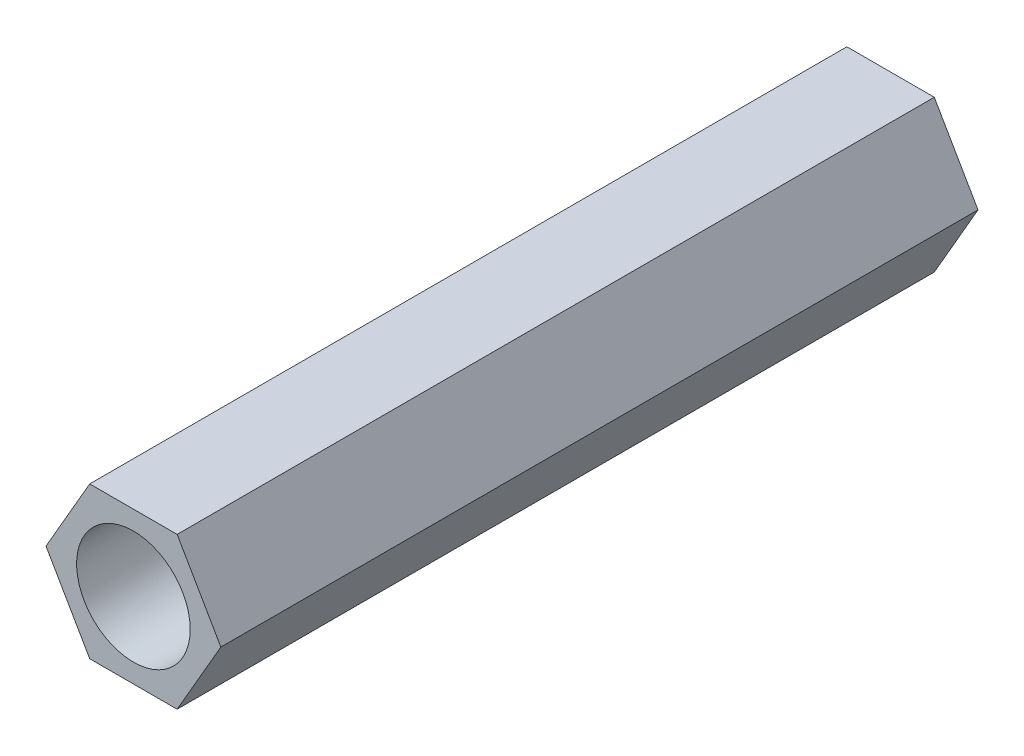
ISO-10303-21;
HEADER;
FILE_DESCRIPTION(('STEP AP214'),'2;1');
FILE_NAME('part.step','',(''),(''),'','','');
FILE_SCHEMA(('AUTOMOTIVE_DESIGN { 1 0 10303 214 1 1 1 1 }'));
ENDSEC;
DATA;
#1=APPLICATION_CONTEXT('core data for automotive mechanical design processes');
#2=APPLICATION_PROTOCOL_DEFINITION('international standard','automotive_design',2000,#1);
#3=PRODUCT_CONTEXT('',#1,'mechanical');
#4=PRODUCT('Part','Part','',(#3));
#5=PRODUCT_RELATED_PRODUCT_CATEGORY('part','',(#4));
#6=PRODUCT_DEFINITION_FORMATION('','',#4);
#7=PRODUCT_DEFINITION_CONTEXT('part definition',#1,'design');
#8=PRODUCT_DEFINITION('design','',#6,#7);
#9=PRODUCT_DEFINITION_SHAPE('','',#8);
#10=(LENGTH_UNIT() NAMED_UNIT(*) SI_UNIT(.MILLI.,.METRE.));
#11=(NAMED_UNIT(*) PLANE_ANGLE_UNIT() SI_UNIT($,.RADIAN.));
#12=(NAMED_UNIT(*) SI_UNIT($,.STERADIAN.) SOLID_ANGLE_UNIT());
#13=UNCERTAINTY_MEASURE_WITH_UNIT(LENGTH_MEASURE(1.E-05),#10,'distance_accuracy_value','');
#14=(GEOMETRIC_REPRESENTATION_CONTEXT(3) GLOBAL_UNCERTAINTY_ASSIGNED_CONTEXT((#13)) GLOBAL_UNIT_ASSIGNED_CONTEXT((#10,
#11,#12)) REPRESENTATION_CONTEXT('',''));
#15=CARTESIAN_POINT('',(0.,0.,0.));
#16=DIRECTION('',(0.,0.,1.));
#17=DIRECTION('',(1.,0.,0.));
#18=AXIS2_PLACEMENT_3D('',#15,#16,#17);
#19=CARTESIAN_POINT('',(0.,0.,20.));
#20=DIRECTION('',(0.,0.,1.));
#21=DIRECTION('',(1.,0.,0.));
#22=AXIS2_PLACEMENT_3D('',#19,#20,#21);
#23=PLANE('',#22);
#24=DIRECTION('',(0.5,0.866025403784439,0.));
#25=VECTOR('',#24,1.);
#26=CARTESIAN_POINT('',(1.15470053837925,-2.,20.));
#27=LINE('',#26,#25);
#28=CARTESIAN_POINT('',(1.15470053837925,-2.,20.));
#29=VERTEX_POINT('',#28);
#30=CARTESIAN_POINT('',(2.3094010767585,0.,20.));
#31=VERTEX_POINT('',#30);
#32=EDGE_CURVE('E156',#29,#31,#27,.T.);
#33=ORIENTED_EDGE('',*,*,#32,.T.);
#34=DIRECTION('',(-0.5,0.866025403784439,0.));
#35=VECTOR('',#34,1.);
#36=CARTESIAN_POINT('',(2.3094010767585,0.,20.));
#37=LINE('',#36,#35);
#38=CARTESIAN_POINT('',(1.15470053837925,2.,20.));
#39=VERTEX_POINT('',#38);
#40=EDGE_CURVE('E104',#31,#39,#37,.T.);
#41=ORIENTED_EDGE('',*,*,#40,.T.);
#42=DIRECTION('',(-1.,0.,0.));
#43=VECTOR('',#42,1.);
#44=CARTESIAN_POINT('',(1.15470053837925,2.,20.));
#45=LINE('',#44,#43);
#46=CARTESIAN_POINT('',(-1.15470053837925,2.,20.));
#47=VERTEX_POINT('',#46);
#48=EDGE_CURVE('E117',#39,#47,#45,.T.);
#49=ORIENTED_EDGE('',*,*,#48,.T.);
#50=DIRECTION('',(-0.5,-0.866025403784439,0.));
#51=VECTOR('',#50,1.);
#52=CARTESIAN_POINT('',(-1.15470053837925,2.,20.));
#53=LINE('',#52,#51);
#54=CARTESIAN_POINT('',(-2.3094010767585,0.,20.));
#55=VERTEX_POINT('',#54);
#56=EDGE_CURVE('E111',#47,#55,#53,.T.);
#57=ORIENTED_EDGE('',*,*,#56,.T.);
#58=DIRECTION('',(0.5,-0.866025403784438,0.));
#59=VECTOR('',#58,1.);
#60=CARTESIAN_POINT('',(-2.3094010767585,0.,20.));
#61=LINE('',#60,#59);
#62=CARTESIAN_POINT('',(-1.15470053837925,-2.,20.));
#63=VERTEX_POINT('',#62);
#64=EDGE_CURVE('E115',#55,#63,#61,.T.);
#65=ORIENTED_EDGE('',*,*,#64,.T.);
#66=DIRECTION('',(1.,0.,0.));
#67=VECTOR('',#66,1.);
#68=CARTESIAN_POINT('',(-1.15470053837925,-2.,20.));
#69=LINE('',#68,#67);
#70=EDGE_CURVE('E67',#63,#29,#69,.T.);
#71=ORIENTED_EDGE('',*,*,#70,.T.);
#72=EDGE_LOOP('',(#33,#41,#49,#57,#65,#71));
#73=FACE_BOUND('',#72,.T.);
#74=CARTESIAN_POINT('',(0.,0.,20.));
#75=DIRECTION('',(0.,0.,1.));
#76=DIRECTION('',(1.,0.,0.));
#77=AXIS2_PLACEMENT_3D('',#74,#75,#76);
#78=CIRCLE('',#77,1.5);
#79=CARTESIAN_POINT('',(1.5,0.,20.));
#80=VERTEX_POINT('',#79);
#81=EDGE_CURVE('E144',#80,#80,#78,.T.);
#82=ORIENTED_EDGE('',*,*,#81,.F.);
#83=EDGE_LOOP('',(#82));
#84=FACE_BOUND('',#83,.T.);
#85=ADVANCED_FACE('F49',(#73,#84),#23,.T.);
#86=CARTESIAN_POINT('',(0.,0.,0.));
#87=DIRECTION('',(0.,0.,1.));
#88=DIRECTION('',(1.,0.,0.));
#89=AXIS2_PLACEMENT_3D('',#86,#87,#88);
#90=PLANE('',#89);
#91=DIRECTION('',(0.5,0.866025403784439,0.));
#92=VECTOR('',#91,1.);
#93=CARTESIAN_POINT('',(1.15470053837925,-2.,0.));
#94=LINE('',#93,#92);
#95=CARTESIAN_POINT('',(1.15470053837925,-2.,0.));
#96=VERTEX_POINT('',#95);
#97=CARTESIAN_POINT('',(2.3094010767585,0.,0.));
#98=VERTEX_POINT('',#97);
#99=EDGE_CURVE('E139',#96,#98,#94,.T.);
#100=ORIENTED_EDGE('',*,*,#99,.F.);
#101=DIRECTION('',(1.,0.,0.));
#102=VECTOR('',#101,1.);
#103=CARTESIAN_POINT('',(-1.15470053837925,-2.,0.));
#104=LINE('',#103,#102);
#105=CARTESIAN_POINT('',(-1.15470053837925,-2.,0.));
#106=VERTEX_POINT('',#105);
#107=EDGE_CURVE('E96',#106,#96,#104,.T.);
#108=ORIENTED_EDGE('',*,*,#107,.F.);
#109=DIRECTION('',(0.5,-0.866025403784438,0.));
#110=VECTOR('',#109,1.);
#111=CARTESIAN_POINT('',(-2.3094010767585,0.,0.));
#112=LINE('',#111,#110);
#113=CARTESIAN_POINT('',(-2.3094010767585,0.,0.));
#114=VERTEX_POINT('',#113);
#115=EDGE_CURVE('E90',#114,#106,#112,.T.);
#116=ORIENTED_EDGE('',*,*,#115,.F.);
#117=DIRECTION('',(-0.5,-0.866025403784439,0.));
#118=VECTOR('',#117,1.);
#119=CARTESIAN_POINT('',(-1.15470053837925,2.,0.));
#120=LINE('',#119,#118);
#121=CARTESIAN_POINT('',(-1.15470053837925,2.,0.));
#122=VERTEX_POINT('',#121);
#123=EDGE_CURVE('E126',#122,#114,#120,.T.);
#124=ORIENTED_EDGE('',*,*,#123,.F.);
#125=DIRECTION('',(-1.,0.,0.));
#126=VECTOR('',#125,1.);
#127=CARTESIAN_POINT('',(1.15470053837925,2.,0.));
#128=LINE('',#127,#126);
#129=CARTESIAN_POINT('',(1.15470053837925,2.,0.));
#130=VERTEX_POINT('',#129);
#131=EDGE_CURVE('E147',#130,#122,#128,.T.);
#132=ORIENTED_EDGE('',*,*,#131,.F.);
#133=DIRECTION('',(-0.5,0.866025403784439,0.));
#134=VECTOR('',#133,1.);
#135=CARTESIAN_POINT('',(2.3094010767585,0.,0.));
#136=LINE('',#135,#134);
#137=EDGE_CURVE('E143',#98,#130,#136,.T.);
#138=ORIENTED_EDGE('',*,*,#137,.F.);
#139=EDGE_LOOP('',(#100,#108,#116,#124,#132,#138));
#140=FACE_BOUND('',#139,.T.);
#141=CARTESIAN_POINT('',(0.,0.,0.));
#142=DIRECTION('',(0.,0.,1.));
#143=DIRECTION('',(1.,0.,0.));
#144=AXIS2_PLACEMENT_3D('',#141,#142,#143);
#145=CIRCLE('',#144,1.5);
#146=CARTESIAN_POINT('',(1.5,0.,0.));
#147=VERTEX_POINT('',#146);
#148=EDGE_CURVE('E289',#147,#147,#145,.T.);
#149=ORIENTED_EDGE('',*,*,#148,.T.);
#150=EDGE_LOOP('',(#149));
#151=FACE_BOUND('',#150,.T.);
#152=ADVANCED_FACE('F169',(#140,#151),#90,.F.);
#153=CARTESIAN_POINT('',(1.15470053837925,-2.,20.));
#154=DIRECTION('',(-0.866025403784439,0.5,0.));
#155=DIRECTION('',(-0.5,-0.866025403784439,0.));
#156=AXIS2_PLACEMENT_3D('',#153,#154,#155);
#157=PLANE('',#156);
#158=ORIENTED_EDGE('',*,*,#99,.T.);
#159=DIRECTION('',(0.,0.,-1.));
#160=VECTOR('',#159,1.);
#161=CARTESIAN_POINT('',(2.3094010767585,0.,20.));
#162=LINE('',#161,#160);
#163=EDGE_CURVE('E11',#31,#98,#162,.T.);
#164=ORIENTED_EDGE('',*,*,#163,.F.);
#165=ORIENTED_EDGE('',*,*,#32,.F.);
#166=DIRECTION('',(0.,0.,-1.));
#167=VECTOR('',#166,1.);
#168=CARTESIAN_POINT('',(1.15470053837925,-2.,20.));
#169=LINE('',#168,#167);
#170=EDGE_CURVE('E135',#29,#96,#169,.T.);
#171=ORIENTED_EDGE('',*,*,#170,.T.);
#172=EDGE_LOOP('',(#158,#164,#165,#171));
#173=FACE_BOUND('',#172,.T.);
#174=ADVANCED_FACE('F51',(#173),#157,.F.);
#175=CARTESIAN_POINT('',(2.3094010767585,0.,20.));
#176=DIRECTION('',(-0.866025403784439,-0.5,0.));
#177=DIRECTION('',(0.5,-0.866025403784439,0.));
#178=AXIS2_PLACEMENT_3D('',#175,#176,#177);
#179=PLANE('',#178);
#180=ORIENTED_EDGE('',*,*,#137,.T.);
#181=DIRECTION('',(0.,0.,-1.));
#182=VECTOR('',#181,1.);
#183=CARTESIAN_POINT('',(1.15470053837925,2.,20.));
#184=LINE('',#183,#182);
#185=EDGE_CURVE('E59',#39,#130,#184,.T.);
#186=ORIENTED_EDGE('',*,*,#185,.F.);
#187=ORIENTED_EDGE('',*,*,#40,.F.);
#188=ORIENTED_EDGE('',*,*,#163,.T.);
#189=EDGE_LOOP('',(#180,#186,#187,#188));
#190=FACE_BOUND('',#189,.T.);
#191=ADVANCED_FACE('F194',(#190),#179,.F.);
#192=CARTESIAN_POINT('',(1.15470053837925,2.,20.));
#193=DIRECTION('',(0.,-1.,0.));
#194=DIRECTION('',(0.,0.,-1.));
#195=AXIS2_PLACEMENT_3D('',#192,#193,#194);
#196=PLANE('',#195);
#197=ORIENTED_EDGE('',*,*,#131,.T.);
#198=DIRECTION('',(0.,0.,-1.));
#199=VECTOR('',#198,1.);
#200=CARTESIAN_POINT('',(-1.15470053837925,2.,20.));
#201=LINE('',#200,#199);
#202=EDGE_CURVE('E128',#47,#122,#201,.T.);
#203=ORIENTED_EDGE('',*,*,#202,.F.);
#204=ORIENTED_EDGE('',*,*,#48,.F.);
#205=ORIENTED_EDGE('',*,*,#185,.T.);
#206=EDGE_LOOP('',(#197,#203,#204,#205));
#207=FACE_BOUND('',#206,.T.);
#208=ADVANCED_FACE('F166',(#207),#196,.F.);
#209=CARTESIAN_POINT('',(-1.15470053837925,2.,20.));
#210=DIRECTION('',(0.866025403784439,-0.5,0.));
#211=DIRECTION('',(0.5,0.866025403784439,0.));
#212=AXIS2_PLACEMENT_3D('',#209,#210,#211);
#213=PLANE('',#212);
#214=ORIENTED_EDGE('',*,*,#123,.T.);
#215=DIRECTION('',(0.,0.,-1.));
#216=VECTOR('',#215,1.);
#217=CARTESIAN_POINT('',(-2.3094010767585,0.,20.));
#218=LINE('',#217,#216);
#219=EDGE_CURVE('E123',#55,#114,#218,.T.);
#220=ORIENTED_EDGE('',*,*,#219,.F.);
#221=ORIENTED_EDGE('',*,*,#56,.F.);
#222=ORIENTED_EDGE('',*,*,#202,.T.);
#223=EDGE_LOOP('',(#214,#220,#221,#222));
#224=FACE_BOUND('',#223,.T.);
#225=ADVANCED_FACE('F124',(#224),#213,.F.);
#226=CARTESIAN_POINT('',(-2.3094010767585,0.,20.));
#227=DIRECTION('',(0.866025403784438,0.5,0.));
#228=DIRECTION('',(-0.5,0.866025403784438,0.));
#229=AXIS2_PLACEMENT_3D('',#226,#227,#228);
#230=PLANE('',#229);
#231=ORIENTED_EDGE('',*,*,#115,.T.);
#232=DIRECTION('',(0.,0.,-1.));
#233=VECTOR('',#232,1.);
#234=CARTESIAN_POINT('',(-1.15470053837925,-2.,20.));
#235=LINE('',#234,#233);
#236=EDGE_CURVE('E129',#63,#106,#235,.T.);
#237=ORIENTED_EDGE('',*,*,#236,.F.);
#238=ORIENTED_EDGE('',*,*,#64,.F.);
#239=ORIENTED_EDGE('',*,*,#219,.T.);
#240=EDGE_LOOP('',(#231,#237,#238,#239));
#241=FACE_BOUND('',#240,.T.);
#242=ADVANCED_FACE('F131',(#241),#230,.F.);
#243=CARTESIAN_POINT('',(-1.15470053837925,-2.,20.));
#244=DIRECTION('',(0.,1.,0.));
#245=DIRECTION('',(0.,0.,1.));
#246=AXIS2_PLACEMENT_3D('',#243,#244,#245);
#247=PLANE('',#246);
#248=ORIENTED_EDGE('',*,*,#107,.T.);
#249=ORIENTED_EDGE('',*,*,#170,.F.);
#250=ORIENTED_EDGE('',*,*,#70,.F.);
#251=ORIENTED_EDGE('',*,*,#236,.T.);
#252=EDGE_LOOP('',(#248,#249,#250,#251));
#253=FACE_BOUND('',#252,.T.);
#254=ADVANCED_FACE('F174',(#253),#247,.F.);
#255=CARTESIAN_POINT('',(0.,0.,20.));
#256=DIRECTION('',(0.,0.,-1.));
#257=DIRECTION('',(-1.,0.,0.));
#258=AXIS2_PLACEMENT_3D('',#255,#256,#257);
#259=CYLINDRICAL_SURFACE('',#258,1.5);
#260=ORIENTED_EDGE('',*,*,#81,.T.);
#261=EDGE_LOOP('',(#260));
#262=FACE_BOUND('',#261,.T.);
#263=ORIENTED_EDGE('',*,*,#148,.F.);
#264=EDGE_LOOP('',(#263));
#265=FACE_BOUND('',#264,.T.);
#266=ADVANCED_FACE('F176',(#262,#265),#259,.F.);
#267=CLOSED_SHELL('',(#85,#152,#174,#191,#208,#225,#242,#254,#266));
#268=MANIFOLD_SOLID_BREP('B2',#267);
#269=ADVANCED_BREP_SHAPE_REPRESENTATION('',(#18,#268),#14);
#270=SHAPE_DEFINITION_REPRESENTATION(#9,#269);
ENDSEC;
END-ISO-10303-21;
